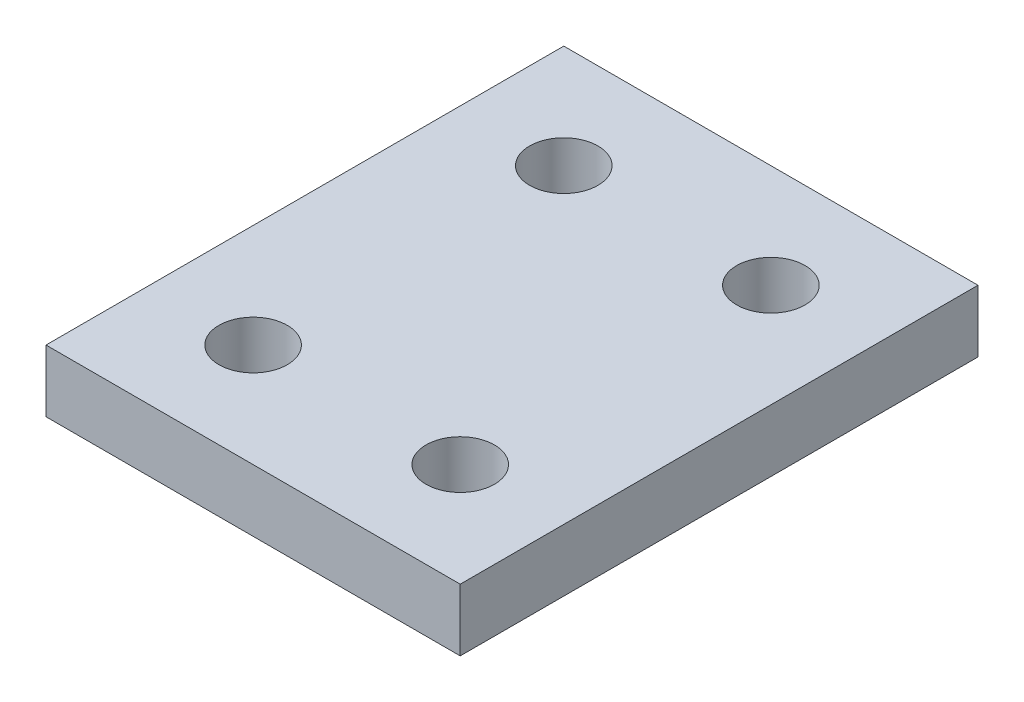
ISO-10303-21;
HEADER;
FILE_DESCRIPTION(('STEP AP214'),'2;1');
FILE_NAME('part.step','',(''),(''),'','','');
FILE_SCHEMA(('AUTOMOTIVE_DESIGN { 1 0 10303 214 1 1 1 1 }'));
ENDSEC;
DATA;
#1=APPLICATION_CONTEXT('core data for automotive mechanical design processes');
#2=APPLICATION_PROTOCOL_DEFINITION('international standard','automotive_design',2000,#1);
#3=PRODUCT_CONTEXT('',#1,'mechanical');
#4=PRODUCT('Part','Part','',(#3));
#5=PRODUCT_RELATED_PRODUCT_CATEGORY('part','',(#4));
#6=PRODUCT_DEFINITION_FORMATION('','',#4);
#7=PRODUCT_DEFINITION_CONTEXT('part definition',#1,'design');
#8=PRODUCT_DEFINITION('design','',#6,#7);
#9=PRODUCT_DEFINITION_SHAPE('','',#8);
#10=(LENGTH_UNIT() NAMED_UNIT(*) SI_UNIT(.MILLI.,.METRE.));
#11=(NAMED_UNIT(*) PLANE_ANGLE_UNIT() SI_UNIT($,.RADIAN.));
#12=(NAMED_UNIT(*) SI_UNIT($,.STERADIAN.) SOLID_ANGLE_UNIT());
#13=UNCERTAINTY_MEASURE_WITH_UNIT(LENGTH_MEASURE(1.E-05),#10,'distance_accuracy_value','');
#14=(GEOMETRIC_REPRESENTATION_CONTEXT(3) GLOBAL_UNCERTAINTY_ASSIGNED_CONTEXT((#13)) GLOBAL_UNIT_ASSIGNED_CONTEXT((#10,
#11,#12)) REPRESENTATION_CONTEXT('',''));
#15=CARTESIAN_POINT('',(0.,0.,0.));
#16=DIRECTION('',(0.,0.,1.));
#17=DIRECTION('',(1.,0.,0.));
#18=AXIS2_PLACEMENT_3D('',#15,#16,#17);
#19=CARTESIAN_POINT('',(10.,3.,-12.5));
#20=DIRECTION('',(-1.,0.,0.));
#21=DIRECTION('',(0.,0.,1.));
#22=AXIS2_PLACEMENT_3D('',#19,#20,#21);
#23=PLANE('',#22);
#24=DIRECTION('',(0.,0.,-1.));
#25=VECTOR('',#24,1.);
#26=CARTESIAN_POINT('',(10.,0.,-12.5));
#27=LINE('',#26,#25);
#28=CARTESIAN_POINT('',(10.,0.,12.5));
#29=VERTEX_POINT('',#28);
#30=CARTESIAN_POINT('',(10.,0.,-12.5));
#31=VERTEX_POINT('',#30);
#32=EDGE_CURVE('E102',#29,#31,#27,.T.);
#33=ORIENTED_EDGE('',*,*,#32,.T.);
#34=DIRECTION('',(0.,-1.,0.));
#35=VECTOR('',#34,1.);
#36=CARTESIAN_POINT('',(10.,3.,-12.5));
#37=LINE('',#36,#35);
#38=CARTESIAN_POINT('',(10.,3.,-12.5));
#39=VERTEX_POINT('',#38);
#40=EDGE_CURVE('E11',#39,#31,#37,.T.);
#41=ORIENTED_EDGE('',*,*,#40,.F.);
#42=DIRECTION('',(0.,0.,-1.));
#43=VECTOR('',#42,1.);
#44=CARTESIAN_POINT('',(10.,3.,-12.5));
#45=LINE('',#44,#43);
#46=CARTESIAN_POINT('',(10.,3.,12.5));
#47=VERTEX_POINT('',#46);
#48=EDGE_CURVE('E90',#47,#39,#45,.T.);
#49=ORIENTED_EDGE('',*,*,#48,.F.);
#50=DIRECTION('',(0.,-1.,0.));
#51=VECTOR('',#50,1.);
#52=CARTESIAN_POINT('',(10.,3.,12.5));
#53=LINE('',#52,#51);
#54=EDGE_CURVE('E98',#47,#29,#53,.T.);
#55=ORIENTED_EDGE('',*,*,#54,.T.);
#56=EDGE_LOOP('',(#33,#41,#49,#55));
#57=FACE_BOUND('',#56,.T.);
#58=ADVANCED_FACE('F39',(#57),#23,.F.);
#59=CARTESIAN_POINT('',(-10.,3.,-12.5));
#60=DIRECTION('',(0.,0.,1.));
#61=DIRECTION('',(1.,0.,0.));
#62=AXIS2_PLACEMENT_3D('',#59,#60,#61);
#63=PLANE('',#62);
#64=DIRECTION('',(-1.,0.,0.));
#65=VECTOR('',#64,1.);
#66=CARTESIAN_POINT('',(-10.,0.,-12.5));
#67=LINE('',#66,#65);
#68=CARTESIAN_POINT('',(-10.,0.,-12.5));
#69=VERTEX_POINT('',#68);
#70=EDGE_CURVE('E94',#31,#69,#67,.T.);
#71=ORIENTED_EDGE('',*,*,#70,.T.);
#72=DIRECTION('',(0.,-1.,0.));
#73=VECTOR('',#72,1.);
#74=CARTESIAN_POINT('',(-10.,3.,-12.5));
#75=LINE('',#74,#73);
#76=CARTESIAN_POINT('',(-10.,3.,-12.5));
#77=VERTEX_POINT('',#76);
#78=EDGE_CURVE('E47',#77,#69,#75,.T.);
#79=ORIENTED_EDGE('',*,*,#78,.F.);
#80=DIRECTION('',(-1.,0.,0.));
#81=VECTOR('',#80,1.);
#82=CARTESIAN_POINT('',(-10.,3.,-12.5));
#83=LINE('',#82,#81);
#84=EDGE_CURVE('E85',#39,#77,#83,.T.);
#85=ORIENTED_EDGE('',*,*,#84,.F.);
#86=ORIENTED_EDGE('',*,*,#40,.T.);
#87=EDGE_LOOP('',(#71,#79,#85,#86));
#88=FACE_BOUND('',#87,.T.);
#89=ADVANCED_FACE('F93',(#88),#63,.F.);
#90=CARTESIAN_POINT('',(-10.,3.,-12.5));
#91=DIRECTION('',(1.,0.,0.));
#92=DIRECTION('',(0.,0.,-1.));
#93=AXIS2_PLACEMENT_3D('',#90,#91,#92);
#94=PLANE('',#93);
#95=DIRECTION('',(0.,0.,1.));
#96=VECTOR('',#95,1.);
#97=CARTESIAN_POINT('',(-10.,0.,-12.5));
#98=LINE('',#97,#96);
#99=CARTESIAN_POINT('',(-10.,0.,12.5));
#100=VERTEX_POINT('',#99);
#101=EDGE_CURVE('E72',#69,#100,#98,.T.);
#102=ORIENTED_EDGE('',*,*,#101,.T.);
#103=DIRECTION('',(0.,-1.,0.));
#104=VECTOR('',#103,1.);
#105=CARTESIAN_POINT('',(-10.,3.,12.5));
#106=LINE('',#105,#104);
#107=CARTESIAN_POINT('',(-10.,3.,12.5));
#108=VERTEX_POINT('',#107);
#109=EDGE_CURVE('E95',#108,#100,#106,.T.);
#110=ORIENTED_EDGE('',*,*,#109,.F.);
#111=DIRECTION('',(0.,0.,1.));
#112=VECTOR('',#111,1.);
#113=CARTESIAN_POINT('',(-10.,3.,-12.5));
#114=LINE('',#113,#112);
#115=EDGE_CURVE('E88',#77,#108,#114,.T.);
#116=ORIENTED_EDGE('',*,*,#115,.F.);
#117=ORIENTED_EDGE('',*,*,#78,.T.);
#118=EDGE_LOOP('',(#102,#110,#116,#117));
#119=FACE_BOUND('',#118,.T.);
#120=ADVANCED_FACE('F96',(#119),#94,.F.);
#121=CARTESIAN_POINT('',(-10.,3.,12.5));
#122=DIRECTION('',(0.,0.,-1.));
#123=DIRECTION('',(-1.,0.,0.));
#124=AXIS2_PLACEMENT_3D('',#121,#122,#123);
#125=PLANE('',#124);
#126=DIRECTION('',(1.,0.,0.));
#127=VECTOR('',#126,1.);
#128=CARTESIAN_POINT('',(-10.,0.,12.5));
#129=LINE('',#128,#127);
#130=EDGE_CURVE('E78',#100,#29,#129,.T.);
#131=ORIENTED_EDGE('',*,*,#130,.T.);
#132=ORIENTED_EDGE('',*,*,#54,.F.);
#133=DIRECTION('',(1.,0.,0.));
#134=VECTOR('',#133,1.);
#135=CARTESIAN_POINT('',(-10.,3.,12.5));
#136=LINE('',#135,#134);
#137=EDGE_CURVE('E55',#108,#47,#136,.T.);
#138=ORIENTED_EDGE('',*,*,#137,.F.);
#139=ORIENTED_EDGE('',*,*,#109,.T.);
#140=EDGE_LOOP('',(#131,#132,#138,#139));
#141=FACE_BOUND('',#140,.T.);
#142=ADVANCED_FACE('F110',(#141),#125,.F.);
#143=CARTESIAN_POINT('',(0.,3.,0.));
#144=DIRECTION('',(0.,1.,0.));
#145=DIRECTION('',(0.,0.,1.));
#146=AXIS2_PLACEMENT_3D('',#143,#144,#145);
#147=PLANE('',#146);
#148=CARTESIAN_POINT('',(-5.,3.,-7.5));
#149=DIRECTION('',(0.,1.,0.));
#150=DIRECTION('',(0.,0.,1.));
#151=AXIS2_PLACEMENT_3D('',#148,#149,#150);
#152=CIRCLE('',#151,1.65000000000001);
#153=CARTESIAN_POINT('',(-5.,3.,-5.84999999999999));
#154=VERTEX_POINT('',#153);
#155=EDGE_CURVE('E136',#154,#154,#152,.T.);
#156=ORIENTED_EDGE('',*,*,#155,.F.);
#157=EDGE_LOOP('',(#156));
#158=FACE_BOUND('',#157,.T.);
#159=CARTESIAN_POINT('',(5.,3.,-7.5));
#160=DIRECTION('',(0.,1.,0.));
#161=DIRECTION('',(0.,0.,1.));
#162=AXIS2_PLACEMENT_3D('',#159,#160,#161);
#163=CIRCLE('',#162,1.65000000000001);
#164=CARTESIAN_POINT('',(5.,3.,-5.84999999999998));
#165=VERTEX_POINT('',#164);
#166=EDGE_CURVE('E130',#165,#165,#163,.T.);
#167=ORIENTED_EDGE('',*,*,#166,.F.);
#168=EDGE_LOOP('',(#167));
#169=FACE_BOUND('',#168,.T.);
#170=CARTESIAN_POINT('',(-5.,3.,7.5));
#171=DIRECTION('',(0.,1.,0.));
#172=DIRECTION('',(0.,0.,1.));
#173=AXIS2_PLACEMENT_3D('',#170,#171,#172);
#174=CIRCLE('',#173,1.65000000000001);
#175=CARTESIAN_POINT('',(-5.,3.,9.15000000000002));
#176=VERTEX_POINT('',#175);
#177=EDGE_CURVE('E124',#176,#176,#174,.T.);
#178=ORIENTED_EDGE('',*,*,#177,.F.);
#179=EDGE_LOOP('',(#178));
#180=FACE_BOUND('',#179,.T.);
#181=CARTESIAN_POINT('',(5.,3.,7.5));
#182=DIRECTION('',(0.,1.,0.));
#183=DIRECTION('',(0.,0.,1.));
#184=AXIS2_PLACEMENT_3D('',#181,#182,#183);
#185=CIRCLE('',#184,1.65000000000001);
#186=CARTESIAN_POINT('',(5.,3.,9.15000000000002));
#187=VERTEX_POINT('',#186);
#188=EDGE_CURVE('E118',#187,#187,#185,.T.);
#189=ORIENTED_EDGE('',*,*,#188,.F.);
#190=EDGE_LOOP('',(#189));
#191=FACE_BOUND('',#190,.T.);
#192=ORIENTED_EDGE('',*,*,#48,.T.);
#193=ORIENTED_EDGE('',*,*,#84,.T.);
#194=ORIENTED_EDGE('',*,*,#115,.T.);
#195=ORIENTED_EDGE('',*,*,#137,.T.);
#196=EDGE_LOOP('',(#192,#193,#194,#195));
#197=FACE_BOUND('',#196,.T.);
#198=ADVANCED_FACE('F86',(#158,#169,#180,#191,#197),#147,.T.);
#199=CARTESIAN_POINT('',(0.,0.,0.));
#200=DIRECTION('',(0.,1.,0.));
#201=DIRECTION('',(0.,0.,1.));
#202=AXIS2_PLACEMENT_3D('',#199,#200,#201);
#203=PLANE('',#202);
#204=CARTESIAN_POINT('',(-5.,0.,-7.5));
#205=DIRECTION('',(0.,1.,0.));
#206=DIRECTION('',(0.,0.,1.));
#207=AXIS2_PLACEMENT_3D('',#204,#205,#206);
#208=CIRCLE('',#207,1.65000000000001);
#209=CARTESIAN_POINT('',(-5.,0.,-5.84999999999999));
#210=VERTEX_POINT('',#209);
#211=EDGE_CURVE('E133',#210,#210,#208,.T.);
#212=ORIENTED_EDGE('',*,*,#211,.T.);
#213=EDGE_LOOP('',(#212));
#214=FACE_BOUND('',#213,.T.);
#215=CARTESIAN_POINT('',(5.,0.,-7.5));
#216=DIRECTION('',(0.,1.,0.));
#217=DIRECTION('',(0.,0.,1.));
#218=AXIS2_PLACEMENT_3D('',#215,#216,#217);
#219=CIRCLE('',#218,1.65000000000001);
#220=CARTESIAN_POINT('',(5.,0.,-5.84999999999998));
#221=VERTEX_POINT('',#220);
#222=EDGE_CURVE('E127',#221,#221,#219,.T.);
#223=ORIENTED_EDGE('',*,*,#222,.T.);
#224=EDGE_LOOP('',(#223));
#225=FACE_BOUND('',#224,.T.);
#226=CARTESIAN_POINT('',(-5.,0.,7.5));
#227=DIRECTION('',(0.,1.,0.));
#228=DIRECTION('',(0.,0.,1.));
#229=AXIS2_PLACEMENT_3D('',#226,#227,#228);
#230=CIRCLE('',#229,1.65000000000001);
#231=CARTESIAN_POINT('',(-5.,0.,9.15000000000002));
#232=VERTEX_POINT('',#231);
#233=EDGE_CURVE('E121',#232,#232,#230,.T.);
#234=ORIENTED_EDGE('',*,*,#233,.T.);
#235=EDGE_LOOP('',(#234));
#236=FACE_BOUND('',#235,.T.);
#237=CARTESIAN_POINT('',(5.,0.,7.5));
#238=DIRECTION('',(0.,1.,0.));
#239=DIRECTION('',(0.,0.,1.));
#240=AXIS2_PLACEMENT_3D('',#237,#238,#239);
#241=CIRCLE('',#240,1.65000000000001);
#242=CARTESIAN_POINT('',(5.,0.,9.15000000000002));
#243=VERTEX_POINT('',#242);
#244=EDGE_CURVE('E105',#243,#243,#241,.T.);
#245=ORIENTED_EDGE('',*,*,#244,.T.);
#246=EDGE_LOOP('',(#245));
#247=FACE_BOUND('',#246,.T.);
#248=ORIENTED_EDGE('',*,*,#32,.F.);
#249=ORIENTED_EDGE('',*,*,#130,.F.);
#250=ORIENTED_EDGE('',*,*,#101,.F.);
#251=ORIENTED_EDGE('',*,*,#70,.F.);
#252=EDGE_LOOP('',(#248,#249,#250,#251));
#253=FACE_BOUND('',#252,.T.);
#254=ADVANCED_FACE('F113',(#214,#225,#236,#247,#253),#203,.F.);
#255=CARTESIAN_POINT('',(5.,3.,7.5));
#256=DIRECTION('',(0.,1.,0.));
#257=DIRECTION('',(0.,0.,1.));
#258=AXIS2_PLACEMENT_3D('',#255,#256,#257);
#259=CYLINDRICAL_SURFACE('',#258,1.65000000000001);
#260=ORIENTED_EDGE('',*,*,#244,.F.);
#261=EDGE_LOOP('',(#260));
#262=FACE_BOUND('',#261,.T.);
#263=ORIENTED_EDGE('',*,*,#188,.T.);
#264=EDGE_LOOP('',(#263));
#265=FACE_BOUND('',#264,.T.);
#266=ADVANCED_FACE('F151',(#262,#265),#259,.F.);
#267=CARTESIAN_POINT('',(-5.,3.,7.5));
#268=DIRECTION('',(0.,1.,0.));
#269=DIRECTION('',(0.,0.,1.));
#270=AXIS2_PLACEMENT_3D('',#267,#268,#269);
#271=CYLINDRICAL_SURFACE('',#270,1.65000000000001);
#272=ORIENTED_EDGE('',*,*,#233,.F.);
#273=EDGE_LOOP('',(#272));
#274=FACE_BOUND('',#273,.T.);
#275=ORIENTED_EDGE('',*,*,#177,.T.);
#276=EDGE_LOOP('',(#275));
#277=FACE_BOUND('',#276,.T.);
#278=ADVANCED_FACE('F153',(#274,#277),#271,.F.);
#279=CARTESIAN_POINT('',(5.,3.,-7.5));
#280=DIRECTION('',(0.,1.,0.));
#281=DIRECTION('',(0.,0.,1.));
#282=AXIS2_PLACEMENT_3D('',#279,#280,#281);
#283=CYLINDRICAL_SURFACE('',#282,1.65000000000001);
#284=ORIENTED_EDGE('',*,*,#222,.F.);
#285=EDGE_LOOP('',(#284));
#286=FACE_BOUND('',#285,.T.);
#287=ORIENTED_EDGE('',*,*,#166,.T.);
#288=EDGE_LOOP('',(#287));
#289=FACE_BOUND('',#288,.T.);
#290=ADVANCED_FACE('F160',(#286,#289),#283,.F.);
#291=CARTESIAN_POINT('',(-5.,3.,-7.5));
#292=DIRECTION('',(0.,1.,0.));
#293=DIRECTION('',(0.,0.,1.));
#294=AXIS2_PLACEMENT_3D('',#291,#292,#293);
#295=CYLINDRICAL_SURFACE('',#294,1.65000000000001);
#296=ORIENTED_EDGE('',*,*,#211,.F.);
#297=EDGE_LOOP('',(#296));
#298=FACE_BOUND('',#297,.T.);
#299=ORIENTED_EDGE('',*,*,#155,.T.);
#300=EDGE_LOOP('',(#299));
#301=FACE_BOUND('',#300,.T.);
#302=ADVANCED_FACE('F140',(#298,#301),#295,.F.);
#303=CLOSED_SHELL('',(#58,#89,#120,#142,#198,#254,#266,#278,#290,#302));
#304=MANIFOLD_SOLID_BREP('B2',#303);
#305=ADVANCED_BREP_SHAPE_REPRESENTATION('',(#18,#304),#14);
#306=SHAPE_DEFINITION_REPRESENTATION(#9,#305);
ENDSEC;
END-ISO-10303-21;
